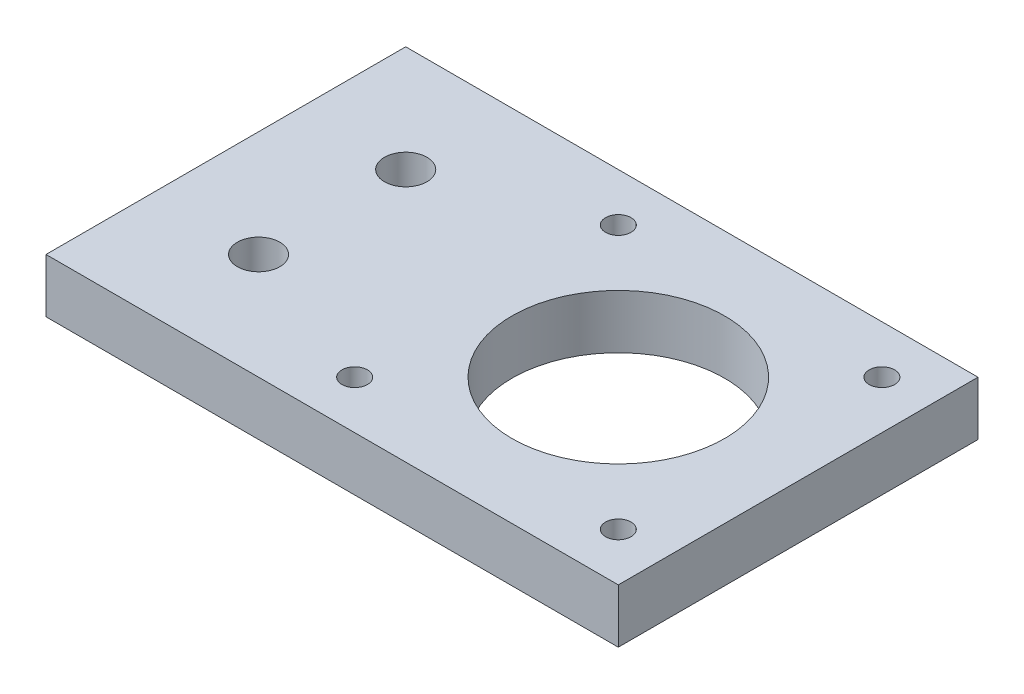
ISO-10303-21;
HEADER;
FILE_DESCRIPTION(('STEP AP214'),'2;1');
FILE_NAME('part.step','',(''),(''),'','','');
FILE_SCHEMA(('AUTOMOTIVE_DESIGN { 1 0 10303 214 1 1 1 1 }'));
ENDSEC;
DATA;
#1=APPLICATION_CONTEXT('core data for automotive mechanical design processes');
#2=APPLICATION_PROTOCOL_DEFINITION('international standard','automotive_design',2000,#1);
#3=PRODUCT_CONTEXT('',#1,'mechanical');
#4=PRODUCT('Part','Part','',(#3));
#5=PRODUCT_RELATED_PRODUCT_CATEGORY('part','',(#4));
#6=PRODUCT_DEFINITION_FORMATION('','',#4);
#7=PRODUCT_DEFINITION_CONTEXT('part definition',#1,'design');
#8=PRODUCT_DEFINITION('design','',#6,#7);
#9=PRODUCT_DEFINITION_SHAPE('','',#8);
#10=(LENGTH_UNIT() NAMED_UNIT(*) SI_UNIT(.MILLI.,.METRE.));
#11=(NAMED_UNIT(*) PLANE_ANGLE_UNIT() SI_UNIT($,.RADIAN.));
#12=(NAMED_UNIT(*) SI_UNIT($,.STERADIAN.) SOLID_ANGLE_UNIT());
#13=UNCERTAINTY_MEASURE_WITH_UNIT(LENGTH_MEASURE(1.E-05),#10,'distance_accuracy_value','');
#14=(GEOMETRIC_REPRESENTATION_CONTEXT(3) GLOBAL_UNCERTAINTY_ASSIGNED_CONTEXT((#13)) GLOBAL_UNIT_ASSIGNED_CONTEXT((#10,
#11,#12)) REPRESENTATION_CONTEXT('',''));
#15=CARTESIAN_POINT('',(0.,0.,0.));
#16=DIRECTION('',(0.,0.,1.));
#17=DIRECTION('',(1.,0.,0.));
#18=AXIS2_PLACEMENT_3D('',#15,#16,#17);
#19=CARTESIAN_POINT('',(0.,3.175,0.));
#20=DIRECTION('',(0.,-1.,0.));
#21=DIRECTION('',(0.,0.,-1.));
#22=AXIS2_PLACEMENT_3D('',#19,#20,#21);
#23=PLANE('',#22);
#24=DIRECTION('',(0.,0.,1.));
#25=VECTOR('',#24,1.);
#26=CARTESIAN_POINT('',(-46.15,3.175,21.15));
#27=LINE('',#26,#25);
#28=CARTESIAN_POINT('',(-46.15,3.175,-21.15));
#29=VERTEX_POINT('',#28);
#30=CARTESIAN_POINT('',(-46.15,3.175,21.15));
#31=VERTEX_POINT('',#30);
#32=EDGE_CURVE('E84',#29,#31,#27,.T.);
#33=ORIENTED_EDGE('',*,*,#32,.T.);
#34=DIRECTION('',(1.,0.,0.));
#35=VECTOR('',#34,1.);
#36=CARTESIAN_POINT('',(-46.15,3.175,21.15));
#37=LINE('',#36,#35);
#38=CARTESIAN_POINT('',(21.15,3.175,21.15));
#39=VERTEX_POINT('',#38);
#40=EDGE_CURVE('E79',#31,#39,#37,.T.);
#41=ORIENTED_EDGE('',*,*,#40,.T.);
#42=DIRECTION('',(0.,0.,-1.));
#43=VECTOR('',#42,1.);
#44=CARTESIAN_POINT('',(21.15,3.175,21.15));
#45=LINE('',#44,#43);
#46=CARTESIAN_POINT('',(21.15,3.175,-21.15));
#47=VERTEX_POINT('',#46);
#48=EDGE_CURVE('E82',#39,#47,#45,.T.);
#49=ORIENTED_EDGE('',*,*,#48,.T.);
#50=DIRECTION('',(-1.,0.,0.));
#51=VECTOR('',#50,1.);
#52=CARTESIAN_POINT('',(-46.15,3.175,-21.15));
#53=LINE('',#52,#51);
#54=EDGE_CURVE('E49',#47,#29,#53,.T.);
#55=ORIENTED_EDGE('',*,*,#54,.T.);
#56=EDGE_LOOP('',(#33,#41,#49,#55));
#57=FACE_BOUND('',#56,.T.);
#58=CARTESIAN_POINT('',(15.5,3.175,15.5));
#59=DIRECTION('',(0.,1.,0.));
#60=DIRECTION('',(0.,0.,1.));
#61=AXIS2_PLACEMENT_3D('',#58,#59,#60);
#62=CIRCLE('',#61,1.5);
#63=CARTESIAN_POINT('',(15.5,3.175,17.));
#64=VERTEX_POINT('',#63);
#65=EDGE_CURVE('E99',#64,#64,#62,.T.);
#66=ORIENTED_EDGE('',*,*,#65,.F.);
#67=EDGE_LOOP('',(#66));
#68=FACE_BOUND('',#67,.T.);
#69=CARTESIAN_POINT('',(15.5,3.175,-15.5));
#70=DIRECTION('',(0.,1.,0.));
#71=DIRECTION('',(0.,0.,1.));
#72=AXIS2_PLACEMENT_3D('',#69,#70,#71);
#73=CIRCLE('',#72,1.5);
#74=CARTESIAN_POINT('',(15.5,3.175,-14.));
#75=VERTEX_POINT('',#74);
#76=EDGE_CURVE('E114',#75,#75,#73,.T.);
#77=ORIENTED_EDGE('',*,*,#76,.F.);
#78=EDGE_LOOP('',(#77));
#79=FACE_BOUND('',#78,.T.);
#80=CARTESIAN_POINT('',(-15.5,3.175,-15.5));
#81=DIRECTION('',(0.,1.,0.));
#82=DIRECTION('',(0.,0.,1.));
#83=AXIS2_PLACEMENT_3D('',#80,#81,#82);
#84=CIRCLE('',#83,1.5);
#85=CARTESIAN_POINT('',(-15.5,3.175,-14.));
#86=VERTEX_POINT('',#85);
#87=EDGE_CURVE('E120',#86,#86,#84,.T.);
#88=ORIENTED_EDGE('',*,*,#87,.F.);
#89=EDGE_LOOP('',(#88));
#90=FACE_BOUND('',#89,.T.);
#91=CARTESIAN_POINT('',(-15.5,3.175,15.5));
#92=DIRECTION('',(0.,1.,0.));
#93=DIRECTION('',(0.,0.,1.));
#94=AXIS2_PLACEMENT_3D('',#91,#92,#93);
#95=CIRCLE('',#94,1.5);
#96=CARTESIAN_POINT('',(-15.5,3.175,17.));
#97=VERTEX_POINT('',#96);
#98=EDGE_CURVE('E126',#97,#97,#95,.T.);
#99=ORIENTED_EDGE('',*,*,#98,.F.);
#100=EDGE_LOOP('',(#99));
#101=FACE_BOUND('',#100,.T.);
#102=CARTESIAN_POINT('',(0.,3.175,0.));
#103=DIRECTION('',(0.,1.,0.));
#104=DIRECTION('',(0.,0.,1.));
#105=AXIS2_PLACEMENT_3D('',#102,#103,#104);
#106=CIRCLE('',#105,12.5);
#107=CARTESIAN_POINT('',(0.,3.175,12.5));
#108=VERTEX_POINT('',#107);
#109=EDGE_CURVE('E132',#108,#108,#106,.T.);
#110=ORIENTED_EDGE('',*,*,#109,.F.);
#111=EDGE_LOOP('',(#110));
#112=FACE_BOUND('',#111,.T.);
#113=CARTESIAN_POINT('',(-33.65,3.175,-8.65));
#114=DIRECTION('',(0.,1.,0.));
#115=DIRECTION('',(0.,0.,1.));
#116=AXIS2_PLACEMENT_3D('',#113,#114,#115);
#117=CIRCLE('',#116,2.5);
#118=CARTESIAN_POINT('',(-33.65,3.175,-6.14999999999999));
#119=VERTEX_POINT('',#118);
#120=EDGE_CURVE('E138',#119,#119,#117,.T.);
#121=ORIENTED_EDGE('',*,*,#120,.F.);
#122=EDGE_LOOP('',(#121));
#123=FACE_BOUND('',#122,.T.);
#124=CARTESIAN_POINT('',(-33.65,3.175,8.65));
#125=DIRECTION('',(0.,1.,0.));
#126=DIRECTION('',(0.,0.,1.));
#127=AXIS2_PLACEMENT_3D('',#124,#125,#126);
#128=CIRCLE('',#127,2.5);
#129=CARTESIAN_POINT('',(-33.65,3.175,11.15));
#130=VERTEX_POINT('',#129);
#131=EDGE_CURVE('E144',#130,#130,#128,.T.);
#132=ORIENTED_EDGE('',*,*,#131,.F.);
#133=EDGE_LOOP('',(#132));
#134=FACE_BOUND('',#133,.T.);
#135=ADVANCED_FACE('F32',(#57,#68,#79,#90,#101,#112,#123,#134),#23,.F.);
#136=CARTESIAN_POINT('',(0.,-3.175,0.));
#137=DIRECTION('',(0.,-1.,0.));
#138=DIRECTION('',(0.,0.,-1.));
#139=AXIS2_PLACEMENT_3D('',#136,#137,#138);
#140=PLANE('',#139);
#141=CARTESIAN_POINT('',(-33.65,-3.175,-8.65));
#142=DIRECTION('',(0.,1.,0.));
#143=DIRECTION('',(0.,0.,1.));
#144=AXIS2_PLACEMENT_3D('',#141,#142,#143);
#145=CIRCLE('',#144,2.5);
#146=CARTESIAN_POINT('',(-33.65,-3.175,-6.14999999999999));
#147=VERTEX_POINT('',#146);
#148=EDGE_CURVE('E141',#147,#147,#145,.T.);
#149=ORIENTED_EDGE('',*,*,#148,.T.);
#150=EDGE_LOOP('',(#149));
#151=FACE_BOUND('',#150,.T.);
#152=CARTESIAN_POINT('',(-15.5,-3.175,15.5));
#153=DIRECTION('',(0.,1.,0.));
#154=DIRECTION('',(0.,0.,1.));
#155=AXIS2_PLACEMENT_3D('',#152,#153,#154);
#156=CIRCLE('',#155,1.5);
#157=CARTESIAN_POINT('',(-15.5,-3.175,17.));
#158=VERTEX_POINT('',#157);
#159=EDGE_CURVE('E129',#158,#158,#156,.T.);
#160=ORIENTED_EDGE('',*,*,#159,.T.);
#161=EDGE_LOOP('',(#160));
#162=FACE_BOUND('',#161,.T.);
#163=CARTESIAN_POINT('',(15.5,-3.175,-15.5));
#164=DIRECTION('',(0.,1.,0.));
#165=DIRECTION('',(0.,0.,1.));
#166=AXIS2_PLACEMENT_3D('',#163,#164,#165);
#167=CIRCLE('',#166,1.5);
#168=CARTESIAN_POINT('',(15.5,-3.175,-14.));
#169=VERTEX_POINT('',#168);
#170=EDGE_CURVE('E117',#169,#169,#167,.T.);
#171=ORIENTED_EDGE('',*,*,#170,.T.);
#172=EDGE_LOOP('',(#171));
#173=FACE_BOUND('',#172,.T.);
#174=DIRECTION('',(0.,0.,1.));
#175=VECTOR('',#174,1.);
#176=CARTESIAN_POINT('',(-46.15,-3.175,21.15));
#177=LINE('',#176,#175);
#178=CARTESIAN_POINT('',(-46.15,-3.175,-21.15));
#179=VERTEX_POINT('',#178);
#180=CARTESIAN_POINT('',(-46.15,-3.175,21.15));
#181=VERTEX_POINT('',#180);
#182=EDGE_CURVE('E96',#179,#181,#177,.T.);
#183=ORIENTED_EDGE('',*,*,#182,.F.);
#184=DIRECTION('',(-1.,0.,0.));
#185=VECTOR('',#184,1.);
#186=CARTESIAN_POINT('',(-46.15,-3.175,-21.15));
#187=LINE('',#186,#185);
#188=CARTESIAN_POINT('',(21.15,-3.175,-21.15));
#189=VERTEX_POINT('',#188);
#190=EDGE_CURVE('E72',#189,#179,#187,.T.);
#191=ORIENTED_EDGE('',*,*,#190,.F.);
#192=DIRECTION('',(0.,0.,-1.));
#193=VECTOR('',#192,1.);
#194=CARTESIAN_POINT('',(21.15,-3.175,21.15));
#195=LINE('',#194,#193);
#196=CARTESIAN_POINT('',(21.15,-3.175,21.15));
#197=VERTEX_POINT('',#196);
#198=EDGE_CURVE('E66',#197,#189,#195,.T.);
#199=ORIENTED_EDGE('',*,*,#198,.F.);
#200=DIRECTION('',(1.,0.,0.));
#201=VECTOR('',#200,1.);
#202=CARTESIAN_POINT('',(-46.15,-3.175,21.15));
#203=LINE('',#202,#201);
#204=EDGE_CURVE('E88',#181,#197,#203,.T.);
#205=ORIENTED_EDGE('',*,*,#204,.F.);
#206=EDGE_LOOP('',(#183,#191,#199,#205));
#207=FACE_BOUND('',#206,.T.);
#208=CARTESIAN_POINT('',(15.5,-3.175,15.5));
#209=DIRECTION('',(0.,1.,0.));
#210=DIRECTION('',(0.,0.,1.));
#211=AXIS2_PLACEMENT_3D('',#208,#209,#210);
#212=CIRCLE('',#211,1.5);
#213=CARTESIAN_POINT('',(15.5,-3.175,17.));
#214=VERTEX_POINT('',#213);
#215=EDGE_CURVE('E111',#214,#214,#212,.T.);
#216=ORIENTED_EDGE('',*,*,#215,.T.);
#217=EDGE_LOOP('',(#216));
#218=FACE_BOUND('',#217,.T.);
#219=CARTESIAN_POINT('',(-15.5,-3.175,-15.5));
#220=DIRECTION('',(0.,1.,0.));
#221=DIRECTION('',(0.,0.,1.));
#222=AXIS2_PLACEMENT_3D('',#219,#220,#221);
#223=CIRCLE('',#222,1.5);
#224=CARTESIAN_POINT('',(-15.5,-3.175,-14.));
#225=VERTEX_POINT('',#224);
#226=EDGE_CURVE('E123',#225,#225,#223,.T.);
#227=ORIENTED_EDGE('',*,*,#226,.T.);
#228=EDGE_LOOP('',(#227));
#229=FACE_BOUND('',#228,.T.);
#230=CARTESIAN_POINT('',(0.,-3.175,0.));
#231=DIRECTION('',(0.,1.,0.));
#232=DIRECTION('',(0.,0.,1.));
#233=AXIS2_PLACEMENT_3D('',#230,#231,#232);
#234=CIRCLE('',#233,12.5);
#235=CARTESIAN_POINT('',(0.,-3.175,12.5));
#236=VERTEX_POINT('',#235);
#237=EDGE_CURVE('E135',#236,#236,#234,.T.);
#238=ORIENTED_EDGE('',*,*,#237,.T.);
#239=EDGE_LOOP('',(#238));
#240=FACE_BOUND('',#239,.T.);
#241=CARTESIAN_POINT('',(-33.65,-3.175,8.65));
#242=DIRECTION('',(0.,1.,0.));
#243=DIRECTION('',(0.,0.,1.));
#244=AXIS2_PLACEMENT_3D('',#241,#242,#243);
#245=CIRCLE('',#244,2.5);
#246=CARTESIAN_POINT('',(-33.65,-3.175,11.15));
#247=VERTEX_POINT('',#246);
#248=EDGE_CURVE('E147',#247,#247,#245,.T.);
#249=ORIENTED_EDGE('',*,*,#248,.T.);
#250=EDGE_LOOP('',(#249));
#251=FACE_BOUND('',#250,.T.);
#252=ADVANCED_FACE('F107',(#151,#162,#173,#207,#218,#229,#240,#251),#140,.T.);
#253=CARTESIAN_POINT('',(-46.15,3.175,21.15));
#254=DIRECTION('',(1.,0.,0.));
#255=DIRECTION('',(0.,0.,-1.));
#256=AXIS2_PLACEMENT_3D('',#253,#254,#255);
#257=PLANE('',#256);
#258=ORIENTED_EDGE('',*,*,#182,.T.);
#259=DIRECTION('',(0.,-1.,0.));
#260=VECTOR('',#259,1.);
#261=CARTESIAN_POINT('',(-46.15,3.175,21.15));
#262=LINE('',#261,#260);
#263=EDGE_CURVE('E11',#31,#181,#262,.T.);
#264=ORIENTED_EDGE('',*,*,#263,.F.);
#265=ORIENTED_EDGE('',*,*,#32,.F.);
#266=DIRECTION('',(0.,-1.,0.));
#267=VECTOR('',#266,1.);
#268=CARTESIAN_POINT('',(-46.15,3.175,-21.15));
#269=LINE('',#268,#267);
#270=EDGE_CURVE('E92',#29,#179,#269,.T.);
#271=ORIENTED_EDGE('',*,*,#270,.T.);
#272=EDGE_LOOP('',(#258,#264,#265,#271));
#273=FACE_BOUND('',#272,.T.);
#274=ADVANCED_FACE('F34',(#273),#257,.F.);
#275=CARTESIAN_POINT('',(-46.15,3.175,21.15));
#276=DIRECTION('',(0.,0.,-1.));
#277=DIRECTION('',(-1.,0.,0.));
#278=AXIS2_PLACEMENT_3D('',#275,#276,#277);
#279=PLANE('',#278);
#280=ORIENTED_EDGE('',*,*,#204,.T.);
#281=DIRECTION('',(0.,-1.,0.));
#282=VECTOR('',#281,1.);
#283=CARTESIAN_POINT('',(21.15,3.175,21.15));
#284=LINE('',#283,#282);
#285=EDGE_CURVE('E41',#39,#197,#284,.T.);
#286=ORIENTED_EDGE('',*,*,#285,.F.);
#287=ORIENTED_EDGE('',*,*,#40,.F.);
#288=ORIENTED_EDGE('',*,*,#263,.T.);
#289=EDGE_LOOP('',(#280,#286,#287,#288));
#290=FACE_BOUND('',#289,.T.);
#291=ADVANCED_FACE('F87',(#290),#279,.F.);
#292=CARTESIAN_POINT('',(21.15,3.175,21.15));
#293=DIRECTION('',(-1.,0.,0.));
#294=DIRECTION('',(0.,0.,1.));
#295=AXIS2_PLACEMENT_3D('',#292,#293,#294);
#296=PLANE('',#295);
#297=ORIENTED_EDGE('',*,*,#198,.T.);
#298=DIRECTION('',(0.,-1.,0.));
#299=VECTOR('',#298,1.);
#300=CARTESIAN_POINT('',(21.15,3.175,-21.15));
#301=LINE('',#300,#299);
#302=EDGE_CURVE('E89',#47,#189,#301,.T.);
#303=ORIENTED_EDGE('',*,*,#302,.F.);
#304=ORIENTED_EDGE('',*,*,#48,.F.);
#305=ORIENTED_EDGE('',*,*,#285,.T.);
#306=EDGE_LOOP('',(#297,#303,#304,#305));
#307=FACE_BOUND('',#306,.T.);
#308=ADVANCED_FACE('F90',(#307),#296,.F.);
#309=CARTESIAN_POINT('',(-46.15,3.175,-21.15));
#310=DIRECTION('',(0.,0.,1.));
#311=DIRECTION('',(1.,0.,0.));
#312=AXIS2_PLACEMENT_3D('',#309,#310,#311);
#313=PLANE('',#312);
#314=ORIENTED_EDGE('',*,*,#190,.T.);
#315=ORIENTED_EDGE('',*,*,#270,.F.);
#316=ORIENTED_EDGE('',*,*,#54,.F.);
#317=ORIENTED_EDGE('',*,*,#302,.T.);
#318=EDGE_LOOP('',(#314,#315,#316,#317));
#319=FACE_BOUND('',#318,.T.);
#320=ADVANCED_FACE('F104',(#319),#313,.F.);
#321=CARTESIAN_POINT('',(15.5,3.175,15.5));
#322=DIRECTION('',(0.,-1.,0.));
#323=DIRECTION('',(0.,0.,-1.));
#324=AXIS2_PLACEMENT_3D('',#321,#322,#323);
#325=CYLINDRICAL_SURFACE('',#324,1.5);
#326=ORIENTED_EDGE('',*,*,#65,.T.);
#327=EDGE_LOOP('',(#326));
#328=FACE_BOUND('',#327,.T.);
#329=ORIENTED_EDGE('',*,*,#215,.F.);
#330=EDGE_LOOP('',(#329));
#331=FACE_BOUND('',#330,.T.);
#332=ADVANCED_FACE('F164',(#328,#331),#325,.F.);
#333=CARTESIAN_POINT('',(15.5,3.175,-15.5));
#334=DIRECTION('',(0.,-1.,0.));
#335=DIRECTION('',(0.,0.,-1.));
#336=AXIS2_PLACEMENT_3D('',#333,#334,#335);
#337=CYLINDRICAL_SURFACE('',#336,1.5);
#338=ORIENTED_EDGE('',*,*,#76,.T.);
#339=EDGE_LOOP('',(#338));
#340=FACE_BOUND('',#339,.T.);
#341=ORIENTED_EDGE('',*,*,#170,.F.);
#342=EDGE_LOOP('',(#341));
#343=FACE_BOUND('',#342,.T.);
#344=ADVANCED_FACE('F210',(#340,#343),#337,.F.);
#345=CARTESIAN_POINT('',(-15.5,3.175,-15.5));
#346=DIRECTION('',(0.,-1.,0.));
#347=DIRECTION('',(0.,0.,-1.));
#348=AXIS2_PLACEMENT_3D('',#345,#346,#347);
#349=CYLINDRICAL_SURFACE('',#348,1.5);
#350=ORIENTED_EDGE('',*,*,#87,.T.);
#351=EDGE_LOOP('',(#350));
#352=FACE_BOUND('',#351,.T.);
#353=ORIENTED_EDGE('',*,*,#226,.F.);
#354=EDGE_LOOP('',(#353));
#355=FACE_BOUND('',#354,.T.);
#356=ADVANCED_FACE('F218',(#352,#355),#349,.F.);
#357=CARTESIAN_POINT('',(-15.5,3.175,15.5));
#358=DIRECTION('',(0.,-1.,0.));
#359=DIRECTION('',(0.,0.,-1.));
#360=AXIS2_PLACEMENT_3D('',#357,#358,#359);
#361=CYLINDRICAL_SURFACE('',#360,1.5);
#362=ORIENTED_EDGE('',*,*,#98,.T.);
#363=EDGE_LOOP('',(#362));
#364=FACE_BOUND('',#363,.T.);
#365=ORIENTED_EDGE('',*,*,#159,.F.);
#366=EDGE_LOOP('',(#365));
#367=FACE_BOUND('',#366,.T.);
#368=ADVANCED_FACE('F226',(#364,#367),#361,.F.);
#369=CARTESIAN_POINT('',(0.,3.175,0.));
#370=DIRECTION('',(0.,-1.,0.));
#371=DIRECTION('',(0.,0.,-1.));
#372=AXIS2_PLACEMENT_3D('',#369,#370,#371);
#373=CYLINDRICAL_SURFACE('',#372,12.5);
#374=ORIENTED_EDGE('',*,*,#109,.T.);
#375=EDGE_LOOP('',(#374));
#376=FACE_BOUND('',#375,.T.);
#377=ORIENTED_EDGE('',*,*,#237,.F.);
#378=EDGE_LOOP('',(#377));
#379=FACE_BOUND('',#378,.T.);
#380=ADVANCED_FACE('F235',(#376,#379),#373,.F.);
#381=CARTESIAN_POINT('',(-33.65,3.175,-8.65));
#382=DIRECTION('',(0.,-1.,0.));
#383=DIRECTION('',(0.,0.,-1.));
#384=AXIS2_PLACEMENT_3D('',#381,#382,#383);
#385=CYLINDRICAL_SURFACE('',#384,2.5);
#386=ORIENTED_EDGE('',*,*,#120,.T.);
#387=EDGE_LOOP('',(#386));
#388=FACE_BOUND('',#387,.T.);
#389=ORIENTED_EDGE('',*,*,#148,.F.);
#390=EDGE_LOOP('',(#389));
#391=FACE_BOUND('',#390,.T.);
#392=ADVANCED_FACE('F244',(#388,#391),#385,.F.);
#393=CARTESIAN_POINT('',(-33.65,3.175,8.65));
#394=DIRECTION('',(0.,-1.,0.));
#395=DIRECTION('',(0.,0.,-1.));
#396=AXIS2_PLACEMENT_3D('',#393,#394,#395);
#397=CYLINDRICAL_SURFACE('',#396,2.5);
#398=ORIENTED_EDGE('',*,*,#131,.T.);
#399=EDGE_LOOP('',(#398));
#400=FACE_BOUND('',#399,.T.);
#401=ORIENTED_EDGE('',*,*,#248,.F.);
#402=EDGE_LOOP('',(#401));
#403=FACE_BOUND('',#402,.T.);
#404=ADVANCED_FACE('F153',(#400,#403),#397,.F.);
#405=CLOSED_SHELL('',(#135,#252,#274,#291,#308,#320,#332,#344,#356,#368,#380,#392,#404));
#406=MANIFOLD_SOLID_BREP('B2',#405);
#407=ADVANCED_BREP_SHAPE_REPRESENTATION('',(#18,#406),#14);
#408=SHAPE_DEFINITION_REPRESENTATION(#9,#407);
ENDSEC;
END-ISO-10303-21;
